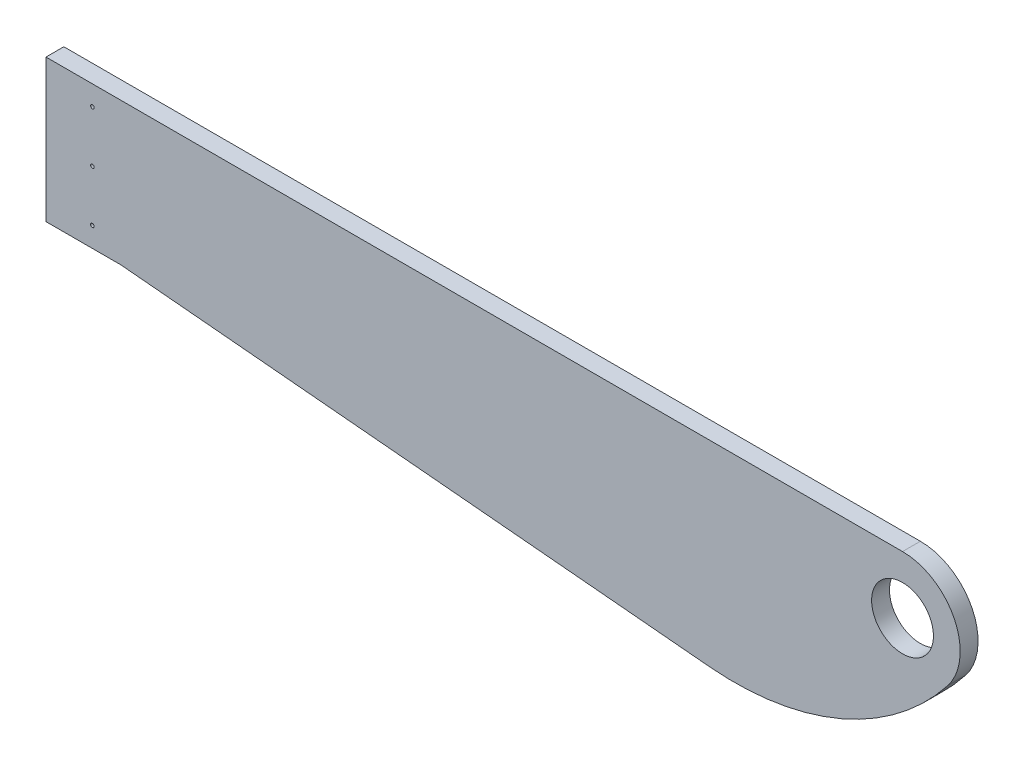
ISO-10303-21;
HEADER;
FILE_DESCRIPTION(('STEP AP214'),'2;1');
FILE_NAME('part.step','',(''),(''),'','','');
FILE_SCHEMA(('AUTOMOTIVE_DESIGN { 1 0 10303 214 1 1 1 1 }'));
ENDSEC;
DATA;
#1=APPLICATION_CONTEXT('core data for automotive mechanical design processes');
#2=APPLICATION_PROTOCOL_DEFINITION('international standard','automotive_design',2000,#1);
#3=PRODUCT_CONTEXT('',#1,'mechanical');
#4=PRODUCT('Part','Part','',(#3));
#5=PRODUCT_RELATED_PRODUCT_CATEGORY('part','',(#4));
#6=PRODUCT_DEFINITION_FORMATION('','',#4);
#7=PRODUCT_DEFINITION_CONTEXT('part definition',#1,'design');
#8=PRODUCT_DEFINITION('design','',#6,#7);
#9=PRODUCT_DEFINITION_SHAPE('','',#8);
#10=(LENGTH_UNIT() NAMED_UNIT(*) SI_UNIT(.MILLI.,.METRE.));
#11=(NAMED_UNIT(*) PLANE_ANGLE_UNIT() SI_UNIT($,.RADIAN.));
#12=(NAMED_UNIT(*) SI_UNIT($,.STERADIAN.) SOLID_ANGLE_UNIT());
#13=UNCERTAINTY_MEASURE_WITH_UNIT(LENGTH_MEASURE(1.E-05),#10,'distance_accuracy_value','');
#14=(GEOMETRIC_REPRESENTATION_CONTEXT(3) GLOBAL_UNCERTAINTY_ASSIGNED_CONTEXT((#13)) GLOBAL_UNIT_ASSIGNED_CONTEXT((#10,
#11,#12)) REPRESENTATION_CONTEXT('',''));
#15=CARTESIAN_POINT('',(0.,0.,0.));
#16=DIRECTION('',(0.,0.,1.));
#17=DIRECTION('',(1.,0.,0.));
#18=AXIS2_PLACEMENT_3D('',#15,#16,#17);
#19=CARTESIAN_POINT('',(299.121841883506,46.7957926054914,6.35));
#20=DIRECTION('',(0.,0.,1.));
#21=DIRECTION('',(1.,0.,0.));
#22=AXIS2_PLACEMENT_3D('',#19,#20,#21);
#23=PLANE('',#22);
#24=CARTESIAN_POINT('',(70.71,-23.1320568481545,6.35));
#25=DIRECTION('',(0.,0.,-1.));
#26=DIRECTION('',(-1.,0.,0.));
#27=AXIS2_PLACEMENT_3D('',#24,#25,#26);
#28=CIRCLE('',#27,0.635000000000002);
#29=CARTESIAN_POINT('',(70.075,-23.1320568481545,6.35));
#30=VERTEX_POINT('',#29);
#31=EDGE_CURVE('E146',#30,#30,#28,.T.);
#32=ORIENTED_EDGE('',*,*,#31,.T.);
#33=EDGE_LOOP('',(#32));
#34=FACE_BOUND('',#33,.T.);
#35=CARTESIAN_POINT('',(70.71,-4.84405684815452,6.35));
#36=DIRECTION('',(0.,0.,-1.));
#37=DIRECTION('',(-1.,0.,0.));
#38=AXIS2_PLACEMENT_3D('',#35,#36,#37);
#39=CIRCLE('',#38,0.635000000000002);
#40=CARTESIAN_POINT('',(70.075,-4.84405684815452,6.35));
#41=VERTEX_POINT('',#40);
#42=EDGE_CURVE('E209',#41,#41,#39,.T.);
#43=ORIENTED_EDGE('',*,*,#42,.T.);
#44=EDGE_LOOP('',(#43));
#45=FACE_BOUND('',#44,.T.);
#46=CARTESIAN_POINT('',(70.71,13.4439431518455,6.35));
#47=DIRECTION('',(0.,0.,-1.));
#48=DIRECTION('',(-1.,0.,0.));
#49=AXIS2_PLACEMENT_3D('',#46,#47,#48);
#50=CIRCLE('',#49,0.635000000000002);
#51=CARTESIAN_POINT('',(70.075,13.4439431518455,6.35));
#52=VERTEX_POINT('',#51);
#53=EDGE_CURVE('E212',#52,#52,#50,.T.);
#54=ORIENTED_EDGE('',*,*,#53,.T.);
#55=EDGE_LOOP('',(#54));
#56=FACE_BOUND('',#55,.T.);
#57=DIRECTION('',(0.995863993011722,-0.0908565210799352,0.));
#58=VECTOR('',#57,1.);
#59=CARTESIAN_POINT('',(80.87,-30.213113696309,6.35));
#60=LINE('',#59,#58);
#61=CARTESIAN_POINT('',(80.87,-30.213113696309,6.35));
#62=VERTEX_POINT('',#61);
#63=CARTESIAN_POINT('',(290.352370468871,-49.325,6.35));
#64=VERTEX_POINT('',#63);
#65=EDGE_CURVE('E137',#62,#64,#60,.T.);
#66=ORIENTED_EDGE('',*,*,#65,.T.);
#67=CARTESIAN_POINT('',(299.121841883506,46.7957926054914,6.35));
#68=DIRECTION('',(0.,0.,1.));
#69=DIRECTION('',(1.,0.,0.));
#70=AXIS2_PLACEMENT_3D('',#67,#68,#69);
#71=CIRCLE('',#70,96.52);
#72=CARTESIAN_POINT('',(375.172105998303,-12.6387741723496,6.35));
#73=VERTEX_POINT('',#72);
#74=EDGE_CURVE('E95',#64,#73,#71,.T.);
#75=ORIENTED_EDGE('',*,*,#74,.T.);
#76=CARTESIAN_POINT('',(359.,0.,6.35));
#77=DIRECTION('',(0.,0.,1.));
#78=DIRECTION('',(1.,0.,0.));
#79=AXIS2_PLACEMENT_3D('',#76,#77,#78);
#80=CIRCLE('',#79,20.525);
#81=CARTESIAN_POINT('',(359.,20.525,6.35));
#82=VERTEX_POINT('',#81);
#83=EDGE_CURVE('E108',#73,#82,#80,.T.);
#84=ORIENTED_EDGE('',*,*,#83,.T.);
#85=DIRECTION('',(-1.,0.,0.));
#86=VECTOR('',#85,1.);
#87=CARTESIAN_POINT('',(54.2,20.525,6.35));
#88=LINE('',#87,#86);
#89=CARTESIAN_POINT('',(54.2,20.525,6.35));
#90=VERTEX_POINT('',#89);
#91=EDGE_CURVE('E102',#82,#90,#88,.T.);
#92=ORIENTED_EDGE('',*,*,#91,.T.);
#93=DIRECTION('',(0.,-1.,0.));
#94=VECTOR('',#93,1.);
#95=CARTESIAN_POINT('',(54.2,-30.213113696309,6.35));
#96=LINE('',#95,#94);
#97=CARTESIAN_POINT('',(54.2,-30.213113696309,6.35));
#98=VERTEX_POINT('',#97);
#99=EDGE_CURVE('E106',#90,#98,#96,.T.);
#100=ORIENTED_EDGE('',*,*,#99,.T.);
#101=DIRECTION('',(1.,0.,0.));
#102=VECTOR('',#101,1.);
#103=CARTESIAN_POINT('',(54.2,-30.213113696309,6.35));
#104=LINE('',#103,#102);
#105=EDGE_CURVE('E58',#98,#62,#104,.T.);
#106=ORIENTED_EDGE('',*,*,#105,.T.);
#107=EDGE_LOOP('',(#66,#75,#84,#92,#100,#106));
#108=FACE_BOUND('',#107,.T.);
#109=CARTESIAN_POINT('',(359.,0.,6.35));
#110=DIRECTION('',(0.,0.,1.));
#111=DIRECTION('',(1.,0.,0.));
#112=AXIS2_PLACEMENT_3D('',#109,#110,#111);
#113=CIRCLE('',#112,11.);
#114=CARTESIAN_POINT('',(370.,0.,6.35));
#115=VERTEX_POINT('',#114);
#116=EDGE_CURVE('E130',#115,#115,#113,.T.);
#117=ORIENTED_EDGE('',*,*,#116,.F.);
#118=EDGE_LOOP('',(#117));
#119=FACE_BOUND('',#118,.T.);
#120=ADVANCED_FACE('F39',(#34,#45,#56,#108,#119),#23,.T.);
#121=CARTESIAN_POINT('',(299.121841883506,46.7957926054914,0.));
#122=DIRECTION('',(0.,0.,1.));
#123=DIRECTION('',(1.,0.,0.));
#124=AXIS2_PLACEMENT_3D('',#121,#122,#123);
#125=PLANE('',#124);
#126=CARTESIAN_POINT('',(70.71,-23.1320568481545,0.));
#127=DIRECTION('',(0.,0.,1.));
#128=DIRECTION('',(1.,0.,0.));
#129=AXIS2_PLACEMENT_3D('',#126,#127,#128);
#130=CIRCLE('',#129,0.635000000000002);
#131=CARTESIAN_POINT('',(71.345,-23.1320568481545,0.));
#132=VERTEX_POINT('',#131);
#133=EDGE_CURVE('E43',#132,#132,#130,.T.);
#134=ORIENTED_EDGE('',*,*,#133,.T.);
#135=EDGE_LOOP('',(#134));
#136=FACE_BOUND('',#135,.T.);
#137=CARTESIAN_POINT('',(70.71,-4.84405684815452,0.));
#138=DIRECTION('',(0.,0.,1.));
#139=DIRECTION('',(1.,0.,0.));
#140=AXIS2_PLACEMENT_3D('',#137,#138,#139);
#141=CIRCLE('',#140,0.635000000000002);
#142=CARTESIAN_POINT('',(71.345,-4.84405684815452,0.));
#143=VERTEX_POINT('',#142);
#144=EDGE_CURVE('E145',#143,#143,#141,.T.);
#145=ORIENTED_EDGE('',*,*,#144,.T.);
#146=EDGE_LOOP('',(#145));
#147=FACE_BOUND('',#146,.T.);
#148=CARTESIAN_POINT('',(70.71,13.4439431518455,0.));
#149=DIRECTION('',(0.,0.,1.));
#150=DIRECTION('',(1.,0.,0.));
#151=AXIS2_PLACEMENT_3D('',#148,#149,#150);
#152=CIRCLE('',#151,0.635000000000002);
#153=CARTESIAN_POINT('',(71.345,13.4439431518455,0.));
#154=VERTEX_POINT('',#153);
#155=EDGE_CURVE('E143',#154,#154,#152,.T.);
#156=ORIENTED_EDGE('',*,*,#155,.T.);
#157=EDGE_LOOP('',(#156));
#158=FACE_BOUND('',#157,.T.);
#159=DIRECTION('',(0.995863993011722,-0.0908565210799352,0.));
#160=VECTOR('',#159,1.);
#161=CARTESIAN_POINT('',(80.87,-30.213113696309,0.));
#162=LINE('',#161,#160);
#163=CARTESIAN_POINT('',(80.87,-30.213113696309,0.));
#164=VERTEX_POINT('',#163);
#165=CARTESIAN_POINT('',(290.352370468871,-49.325,0.));
#166=VERTEX_POINT('',#165);
#167=EDGE_CURVE('E126',#164,#166,#162,.T.);
#168=ORIENTED_EDGE('',*,*,#167,.F.);
#169=DIRECTION('',(1.,0.,0.));
#170=VECTOR('',#169,1.);
#171=CARTESIAN_POINT('',(54.2,-30.213113696309,0.));
#172=LINE('',#171,#170);
#173=CARTESIAN_POINT('',(54.2,-30.213113696309,0.));
#174=VERTEX_POINT('',#173);
#175=EDGE_CURVE('E87',#174,#164,#172,.T.);
#176=ORIENTED_EDGE('',*,*,#175,.F.);
#177=DIRECTION('',(0.,-1.,0.));
#178=VECTOR('',#177,1.);
#179=CARTESIAN_POINT('',(54.2,-30.213113696309,0.));
#180=LINE('',#179,#178);
#181=CARTESIAN_POINT('',(54.2,20.525,0.));
#182=VERTEX_POINT('',#181);
#183=EDGE_CURVE('E81',#182,#174,#180,.T.);
#184=ORIENTED_EDGE('',*,*,#183,.F.);
#185=DIRECTION('',(-1.,0.,0.));
#186=VECTOR('',#185,1.);
#187=CARTESIAN_POINT('',(54.2,20.525,0.));
#188=LINE('',#187,#186);
#189=CARTESIAN_POINT('',(359.,20.525,0.));
#190=VERTEX_POINT('',#189);
#191=EDGE_CURVE('E116',#190,#182,#188,.T.);
#192=ORIENTED_EDGE('',*,*,#191,.F.);
#193=CARTESIAN_POINT('',(359.,0.,0.));
#194=DIRECTION('',(0.,0.,1.));
#195=DIRECTION('',(1.,0.,0.));
#196=AXIS2_PLACEMENT_3D('',#193,#194,#195);
#197=CIRCLE('',#196,20.525);
#198=CARTESIAN_POINT('',(375.172105998303,-12.6387741723496,0.));
#199=VERTEX_POINT('',#198);
#200=EDGE_CURVE('E132',#199,#190,#197,.T.);
#201=ORIENTED_EDGE('',*,*,#200,.F.);
#202=CARTESIAN_POINT('',(299.121841883506,46.7957926054914,0.));
#203=DIRECTION('',(0.,0.,1.));
#204=DIRECTION('',(1.,0.,0.));
#205=AXIS2_PLACEMENT_3D('',#202,#203,#204);
#206=CIRCLE('',#205,96.52);
#207=EDGE_CURVE('E129',#166,#199,#206,.T.);
#208=ORIENTED_EDGE('',*,*,#207,.F.);
#209=EDGE_LOOP('',(#168,#176,#184,#192,#201,#208));
#210=FACE_BOUND('',#209,.T.);
#211=CARTESIAN_POINT('',(359.,0.,0.));
#212=DIRECTION('',(0.,0.,1.));
#213=DIRECTION('',(1.,0.,0.));
#214=AXIS2_PLACEMENT_3D('',#211,#212,#213);
#215=CIRCLE('',#214,11.);
#216=CARTESIAN_POINT('',(370.,0.,0.));
#217=VERTEX_POINT('',#216);
#218=EDGE_CURVE('E151',#217,#217,#215,.T.);
#219=ORIENTED_EDGE('',*,*,#218,.T.);
#220=EDGE_LOOP('',(#219));
#221=FACE_BOUND('',#220,.T.);
#222=ADVANCED_FACE('F171',(#136,#147,#158,#210,#221),#125,.F.);
#223=CARTESIAN_POINT('',(80.87,-30.213113696309,6.35));
#224=DIRECTION('',(0.0908565210799353,0.995863993011722,0.));
#225=DIRECTION('',(-0.995863993011722,0.0908565210799353,0.));
#226=AXIS2_PLACEMENT_3D('',#223,#224,#225);
#227=PLANE('',#226);
#228=ORIENTED_EDGE('',*,*,#167,.T.);
#229=DIRECTION('',(0.,0.,-1.));
#230=VECTOR('',#229,1.);
#231=CARTESIAN_POINT('',(290.352370468871,-49.325,6.35));
#232=LINE('',#231,#230);
#233=EDGE_CURVE('E11',#64,#166,#232,.T.);
#234=ORIENTED_EDGE('',*,*,#233,.F.);
#235=ORIENTED_EDGE('',*,*,#65,.F.);
#236=DIRECTION('',(0.,0.,-1.));
#237=VECTOR('',#236,1.);
#238=CARTESIAN_POINT('',(80.87,-30.213113696309,6.35));
#239=LINE('',#238,#237);
#240=EDGE_CURVE('E122',#62,#164,#239,.T.);
#241=ORIENTED_EDGE('',*,*,#240,.T.);
#242=EDGE_LOOP('',(#228,#234,#235,#241));
#243=FACE_BOUND('',#242,.T.);
#244=ADVANCED_FACE('F41',(#243),#227,.F.);
#245=CARTESIAN_POINT('',(299.121841883506,46.7957926054914,6.35));
#246=DIRECTION('',(0.,0.,-1.));
#247=DIRECTION('',(-1.,0.,0.));
#248=AXIS2_PLACEMENT_3D('',#245,#246,#247);
#249=CYLINDRICAL_SURFACE('',#248,96.52);
#250=ORIENTED_EDGE('',*,*,#207,.T.);
#251=DIRECTION('',(0.,0.,-1.));
#252=VECTOR('',#251,1.);
#253=CARTESIAN_POINT('',(375.172105998303,-12.6387741723496,6.35));
#254=LINE('',#253,#252);
#255=EDGE_CURVE('E49',#73,#199,#254,.T.);
#256=ORIENTED_EDGE('',*,*,#255,.F.);
#257=ORIENTED_EDGE('',*,*,#74,.F.);
#258=ORIENTED_EDGE('',*,*,#233,.T.);
#259=EDGE_LOOP('',(#250,#256,#257,#258));
#260=FACE_BOUND('',#259,.T.);
#261=ADVANCED_FACE('F165',(#260),#249,.T.);
#262=CARTESIAN_POINT('',(359.,0.,6.35));
#263=DIRECTION('',(0.,0.,-1.));
#264=DIRECTION('',(-1.,0.,0.));
#265=AXIS2_PLACEMENT_3D('',#262,#263,#264);
#266=CYLINDRICAL_SURFACE('',#265,20.525);
#267=ORIENTED_EDGE('',*,*,#200,.T.);
#268=DIRECTION('',(0.,0.,-1.));
#269=VECTOR('',#268,1.);
#270=CARTESIAN_POINT('',(359.,20.525,6.35));
#271=LINE('',#270,#269);
#272=EDGE_CURVE('E117',#82,#190,#271,.T.);
#273=ORIENTED_EDGE('',*,*,#272,.F.);
#274=ORIENTED_EDGE('',*,*,#83,.F.);
#275=ORIENTED_EDGE('',*,*,#255,.T.);
#276=EDGE_LOOP('',(#267,#273,#274,#275));
#277=FACE_BOUND('',#276,.T.);
#278=ADVANCED_FACE('F168',(#277),#266,.T.);
#279=CARTESIAN_POINT('',(54.2,20.525,6.35));
#280=DIRECTION('',(0.,-1.,0.));
#281=DIRECTION('',(1.,0.,0.));
#282=AXIS2_PLACEMENT_3D('',#279,#280,#281);
#283=PLANE('',#282);
#284=ORIENTED_EDGE('',*,*,#191,.T.);
#285=DIRECTION('',(0.,0.,-1.));
#286=VECTOR('',#285,1.);
#287=CARTESIAN_POINT('',(54.2,20.525,6.35));
#288=LINE('',#287,#286);
#289=EDGE_CURVE('E113',#90,#182,#288,.T.);
#290=ORIENTED_EDGE('',*,*,#289,.F.);
#291=ORIENTED_EDGE('',*,*,#91,.F.);
#292=ORIENTED_EDGE('',*,*,#272,.T.);
#293=EDGE_LOOP('',(#284,#290,#291,#292));
#294=FACE_BOUND('',#293,.T.);
#295=ADVANCED_FACE('F114',(#294),#283,.F.);
#296=CARTESIAN_POINT('',(54.2,-30.213113696309,6.35));
#297=DIRECTION('',(1.,0.,0.));
#298=DIRECTION('',(0.,0.,-1.));
#299=AXIS2_PLACEMENT_3D('',#296,#297,#298);
#300=PLANE('',#299);
#301=ORIENTED_EDGE('',*,*,#183,.T.);
#302=DIRECTION('',(0.,0.,-1.));
#303=VECTOR('',#302,1.);
#304=CARTESIAN_POINT('',(54.2,-30.213113696309,6.35));
#305=LINE('',#304,#303);
#306=EDGE_CURVE('E118',#98,#174,#305,.T.);
#307=ORIENTED_EDGE('',*,*,#306,.F.);
#308=ORIENTED_EDGE('',*,*,#99,.F.);
#309=ORIENTED_EDGE('',*,*,#289,.T.);
#310=EDGE_LOOP('',(#301,#307,#308,#309));
#311=FACE_BOUND('',#310,.T.);
#312=ADVANCED_FACE('F120',(#311),#300,.F.);
#313=CARTESIAN_POINT('',(54.2,-30.213113696309,6.35));
#314=DIRECTION('',(0.,1.,0.));
#315=DIRECTION('',(-1.,0.,0.));
#316=AXIS2_PLACEMENT_3D('',#313,#314,#315);
#317=PLANE('',#316);
#318=ORIENTED_EDGE('',*,*,#175,.T.);
#319=ORIENTED_EDGE('',*,*,#240,.F.);
#320=ORIENTED_EDGE('',*,*,#105,.F.);
#321=ORIENTED_EDGE('',*,*,#306,.T.);
#322=EDGE_LOOP('',(#318,#319,#320,#321));
#323=FACE_BOUND('',#322,.T.);
#324=ADVANCED_FACE('F173',(#323),#317,.F.);
#325=CARTESIAN_POINT('',(359.,0.,6.35));
#326=DIRECTION('',(0.,0.,-1.));
#327=DIRECTION('',(-1.,0.,0.));
#328=AXIS2_PLACEMENT_3D('',#325,#326,#327);
#329=CYLINDRICAL_SURFACE('',#328,11.);
#330=ORIENTED_EDGE('',*,*,#116,.T.);
#331=EDGE_LOOP('',(#330));
#332=FACE_BOUND('',#331,.T.);
#333=ORIENTED_EDGE('',*,*,#218,.F.);
#334=EDGE_LOOP('',(#333));
#335=FACE_BOUND('',#334,.T.);
#336=ADVANCED_FACE('F175',(#332,#335),#329,.F.);
#337=CARTESIAN_POINT('',(70.71,13.4439431518455,6.35));
#338=DIRECTION('',(0.,0.,-1.));
#339=DIRECTION('',(-1.,0.,0.));
#340=AXIS2_PLACEMENT_3D('',#337,#338,#339);
#341=CYLINDRICAL_SURFACE('',#340,0.635000000000002);
#342=ORIENTED_EDGE('',*,*,#53,.F.);
#343=EDGE_LOOP('',(#342));
#344=FACE_BOUND('',#343,.T.);
#345=ORIENTED_EDGE('',*,*,#155,.F.);
#346=EDGE_LOOP('',(#345));
#347=FACE_BOUND('',#346,.T.);
#348=ADVANCED_FACE('F181',(#344,#347),#341,.F.);
#349=CARTESIAN_POINT('',(70.71,-4.84405684815452,6.35));
#350=DIRECTION('',(0.,0.,-1.));
#351=DIRECTION('',(-1.,0.,0.));
#352=AXIS2_PLACEMENT_3D('',#349,#350,#351);
#353=CYLINDRICAL_SURFACE('',#352,0.635000000000002);
#354=ORIENTED_EDGE('',*,*,#42,.F.);
#355=EDGE_LOOP('',(#354));
#356=FACE_BOUND('',#355,.T.);
#357=ORIENTED_EDGE('',*,*,#144,.F.);
#358=EDGE_LOOP('',(#357));
#359=FACE_BOUND('',#358,.T.);
#360=ADVANCED_FACE('F197',(#356,#359),#353,.F.);
#361=CARTESIAN_POINT('',(70.71,-23.1320568481545,6.35));
#362=DIRECTION('',(0.,0.,-1.));
#363=DIRECTION('',(-1.,0.,0.));
#364=AXIS2_PLACEMENT_3D('',#361,#362,#363);
#365=CYLINDRICAL_SURFACE('',#364,0.635000000000002);
#366=ORIENTED_EDGE('',*,*,#31,.F.);
#367=EDGE_LOOP('',(#366));
#368=FACE_BOUND('',#367,.T.);
#369=ORIENTED_EDGE('',*,*,#133,.F.);
#370=EDGE_LOOP('',(#369));
#371=FACE_BOUND('',#370,.T.);
#372=ADVANCED_FACE('F201',(#368,#371),#365,.F.);
#373=CLOSED_SHELL('',(#120,#222,#244,#261,#278,#295,#312,#324,#336,#348,#360,#372));
#374=MANIFOLD_SOLID_BREP('B2',#373);
#375=ADVANCED_BREP_SHAPE_REPRESENTATION('',(#18,#374),#14);
#376=SHAPE_DEFINITION_REPRESENTATION(#9,#375);
ENDSEC;
END-ISO-10303-21;
